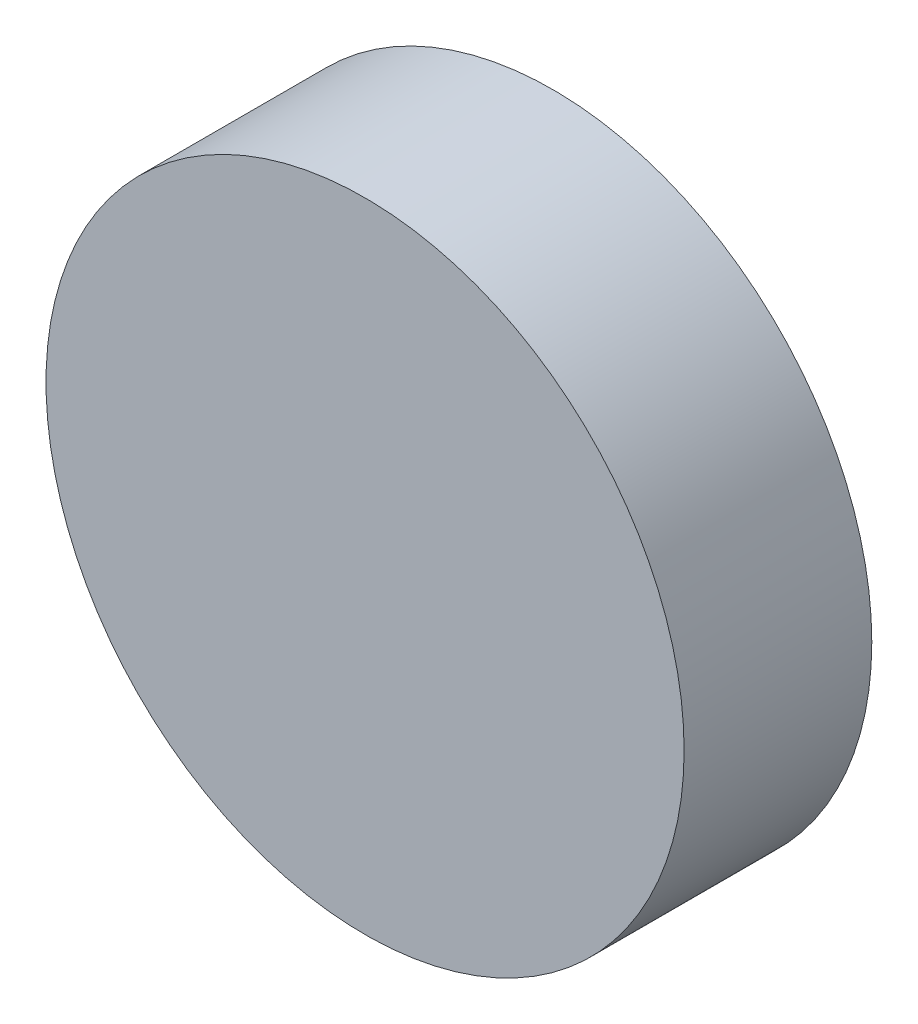
ISO-10303-21;
HEADER;
FILE_DESCRIPTION(('STEP AP214'),'2;1');
FILE_NAME('part.step','',(''),(''),'','','');
FILE_SCHEMA(('AUTOMOTIVE_DESIGN { 1 0 10303 214 1 1 1 1 }'));
ENDSEC;
DATA;
#1=APPLICATION_CONTEXT('core data for automotive mechanical design processes');
#2=APPLICATION_PROTOCOL_DEFINITION('international standard','automotive_design',2000,#1);
#3=PRODUCT_CONTEXT('',#1,'mechanical');
#4=PRODUCT('Part','Part','',(#3));
#5=PRODUCT_RELATED_PRODUCT_CATEGORY('part','',(#4));
#6=PRODUCT_DEFINITION_FORMATION('','',#4);
#7=PRODUCT_DEFINITION_CONTEXT('part definition',#1,'design');
#8=PRODUCT_DEFINITION('design','',#6,#7);
#9=PRODUCT_DEFINITION_SHAPE('','',#8);
#10=(LENGTH_UNIT() NAMED_UNIT(*) SI_UNIT(.MILLI.,.METRE.));
#11=(NAMED_UNIT(*) PLANE_ANGLE_UNIT() SI_UNIT($,.RADIAN.));
#12=(NAMED_UNIT(*) SI_UNIT($,.STERADIAN.) SOLID_ANGLE_UNIT());
#13=UNCERTAINTY_MEASURE_WITH_UNIT(LENGTH_MEASURE(1.E-05),#10,'distance_accuracy_value','');
#14=(GEOMETRIC_REPRESENTATION_CONTEXT(3) GLOBAL_UNCERTAINTY_ASSIGNED_CONTEXT((#13)) GLOBAL_UNIT_ASSIGNED_CONTEXT((#10,
#11,#12)) REPRESENTATION_CONTEXT('',''));
#15=CARTESIAN_POINT('',(0.,0.,0.));
#16=DIRECTION('',(0.,0.,1.));
#17=DIRECTION('',(1.,0.,0.));
#18=AXIS2_PLACEMENT_3D('',#15,#16,#17);
#19=CARTESIAN_POINT('',(40.5060478881834,0.762412285703871,5.));
#20=DIRECTION('',(0.,0.,-1.));
#21=DIRECTION('',(-1.,0.,0.));
#22=AXIS2_PLACEMENT_3D('',#19,#20,#21);
#23=CYLINDRICAL_SURFACE('',#22,8.5);
#24=CARTESIAN_POINT('',(40.5060478881834,0.762412285703871,5.));
#25=DIRECTION('',(0.,0.,1.));
#26=DIRECTION('',(1.,0.,0.));
#27=AXIS2_PLACEMENT_3D('',#24,#25,#26);
#28=CIRCLE('',#27,8.5);
#29=CARTESIAN_POINT('',(49.0060478881834,0.762412285703871,5.));
#30=VERTEX_POINT('',#29);
#31=EDGE_CURVE('E10',#30,#30,#28,.T.);
#32=ORIENTED_EDGE('',*,*,#31,.F.);
#33=EDGE_LOOP('',(#32));
#34=FACE_BOUND('',#33,.T.);
#35=CARTESIAN_POINT('',(40.5060478881834,0.762412285703871,0.));
#36=DIRECTION('',(0.,0.,1.));
#37=DIRECTION('',(1.,0.,0.));
#38=AXIS2_PLACEMENT_3D('',#35,#36,#37);
#39=CIRCLE('',#38,8.5);
#40=CARTESIAN_POINT('',(49.0060478881834,0.762412285703871,0.));
#41=VERTEX_POINT('',#40);
#42=EDGE_CURVE('E36',#41,#41,#39,.T.);
#43=ORIENTED_EDGE('',*,*,#42,.T.);
#44=EDGE_LOOP('',(#43));
#45=FACE_BOUND('',#44,.T.);
#46=ADVANCED_FACE('F33',(#34,#45),#23,.T.);
#47=CARTESIAN_POINT('',(40.5060478881834,0.762412285703871,5.));
#48=DIRECTION('',(0.,0.,1.));
#49=DIRECTION('',(1.,0.,0.));
#50=AXIS2_PLACEMENT_3D('',#47,#48,#49);
#51=PLANE('',#50);
#52=ORIENTED_EDGE('',*,*,#31,.T.);
#53=EDGE_LOOP('',(#52));
#54=FACE_BOUND('',#53,.T.);
#55=ADVANCED_FACE('F48',(#54),#51,.T.);
#56=CARTESIAN_POINT('',(40.5060478881834,0.762412285703871,0.));
#57=DIRECTION('',(0.,0.,1.));
#58=DIRECTION('',(1.,0.,0.));
#59=AXIS2_PLACEMENT_3D('',#56,#57,#58);
#60=PLANE('',#59);
#61=ORIENTED_EDGE('',*,*,#42,.F.);
#62=EDGE_LOOP('',(#61));
#63=FACE_BOUND('',#62,.T.);
#64=ADVANCED_FACE('F46',(#63),#60,.F.);
#65=CLOSED_SHELL('',(#46,#55,#64));
#66=MANIFOLD_SOLID_BREP('B2',#65);
#67=ADVANCED_BREP_SHAPE_REPRESENTATION('',(#18,#66),#14);
#68=SHAPE_DEFINITION_REPRESENTATION(#9,#67);
ENDSEC;
END-ISO-10303-21;
